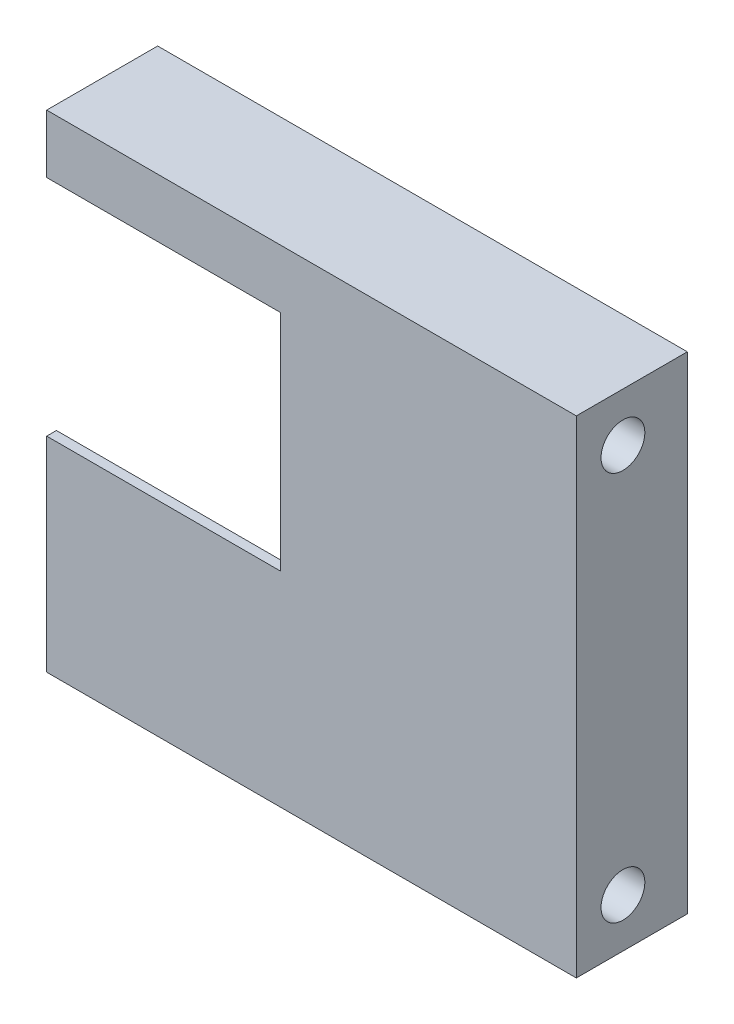
ISO-10303-21;
HEADER;
FILE_DESCRIPTION(('STEP AP214'),'2;1');
FILE_NAME('part.step','',(''),(''),'','','');
FILE_SCHEMA(('AUTOMOTIVE_DESIGN { 1 0 10303 214 1 1 1 1 }'));
ENDSEC;
DATA;
#1=APPLICATION_CONTEXT('core data for automotive mechanical design processes');
#2=APPLICATION_PROTOCOL_DEFINITION('international standard','automotive_design',2000,#1);
#3=PRODUCT_CONTEXT('',#1,'mechanical');
#4=PRODUCT('Part','Part','',(#3));
#5=PRODUCT_RELATED_PRODUCT_CATEGORY('part','',(#4));
#6=PRODUCT_DEFINITION_FORMATION('','',#4);
#7=PRODUCT_DEFINITION_CONTEXT('part definition',#1,'design');
#8=PRODUCT_DEFINITION('design','',#6,#7);
#9=PRODUCT_DEFINITION_SHAPE('','',#8);
#10=(LENGTH_UNIT() NAMED_UNIT(*) SI_UNIT(.MILLI.,.METRE.));
#11=(NAMED_UNIT(*) PLANE_ANGLE_UNIT() SI_UNIT($,.RADIAN.));
#12=(NAMED_UNIT(*) SI_UNIT($,.STERADIAN.) SOLID_ANGLE_UNIT());
#13=UNCERTAINTY_MEASURE_WITH_UNIT(LENGTH_MEASURE(1.E-05),#10,'distance_accuracy_value','');
#14=(GEOMETRIC_REPRESENTATION_CONTEXT(3) GLOBAL_UNCERTAINTY_ASSIGNED_CONTEXT((#13)) GLOBAL_UNIT_ASSIGNED_CONTEXT((#10,
#11,#12)) REPRESENTATION_CONTEXT('',''));
#15=CARTESIAN_POINT('',(0.,0.,0.));
#16=DIRECTION('',(0.,0.,1.));
#17=DIRECTION('',(1.,0.,0.));
#18=AXIS2_PLACEMENT_3D('',#15,#16,#17);
#19=CARTESIAN_POINT('',(25.,0.,0.));
#20=DIRECTION('',(-1.,0.,0.));
#21=DIRECTION('',(0.,0.,1.));
#22=AXIS2_PLACEMENT_3D('',#19,#20,#21);
#23=PLANE('',#22);
#24=DIRECTION('',(0.,0.,1.));
#25=VECTOR('',#24,1.);
#26=CARTESIAN_POINT('',(25.,20.5,-8.4));
#27=LINE('',#26,#25);
#28=CARTESIAN_POINT('',(25.,20.5,-8.4));
#29=VERTEX_POINT('',#28);
#30=CARTESIAN_POINT('',(25.,20.5,-6.4));
#31=VERTEX_POINT('',#30);
#32=EDGE_CURVE('E252',#29,#31,#27,.T.);
#33=ORIENTED_EDGE('',*,*,#32,.F.);
#34=DIRECTION('',(0.,-1.,0.));
#35=VECTOR('',#34,1.);
#36=CARTESIAN_POINT('',(25.,25.,-8.4));
#37=LINE('',#36,#35);
#38=CARTESIAN_POINT('',(25.,19.5,-8.4));
#39=VERTEX_POINT('',#38);
#40=EDGE_CURVE('E53',#29,#39,#37,.T.);
#41=ORIENTED_EDGE('',*,*,#40,.T.);
#42=DIRECTION('',(0.,0.,1.));
#43=VECTOR('',#42,1.);
#44=CARTESIAN_POINT('',(25.,19.5,-10.4));
#45=LINE('',#44,#43);
#46=CARTESIAN_POINT('',(25.,19.5,-10.4));
#47=VERTEX_POINT('',#46);
#48=EDGE_CURVE('E223',#47,#39,#45,.T.);
#49=ORIENTED_EDGE('',*,*,#48,.F.);
#50=DIRECTION('',(0.,1.,0.));
#51=VECTOR('',#50,1.);
#52=CARTESIAN_POINT('',(25.,25.,-10.4));
#53=LINE('',#52,#51);
#54=CARTESIAN_POINT('',(25.,-19.5,-10.4));
#55=VERTEX_POINT('',#54);
#56=EDGE_CURVE('E297',#55,#47,#53,.T.);
#57=ORIENTED_EDGE('',*,*,#56,.F.);
#58=DIRECTION('',(0.,0.,1.));
#59=VECTOR('',#58,1.);
#60=CARTESIAN_POINT('',(25.,-19.5,-10.4));
#61=LINE('',#60,#59);
#62=CARTESIAN_POINT('',(25.,-19.5,-8.4));
#63=VERTEX_POINT('',#62);
#64=EDGE_CURVE('E62',#55,#63,#61,.T.);
#65=ORIENTED_EDGE('',*,*,#64,.T.);
#66=DIRECTION('',(0.,-1.,0.));
#67=VECTOR('',#66,1.);
#68=CARTESIAN_POINT('',(25.,-19.5,-8.4));
#69=LINE('',#68,#67);
#70=CARTESIAN_POINT('',(25.,-20.5,-8.4));
#71=VERTEX_POINT('',#70);
#72=EDGE_CURVE('E221',#63,#71,#69,.T.);
#73=ORIENTED_EDGE('',*,*,#72,.T.);
#74=DIRECTION('',(0.,0.,1.));
#75=VECTOR('',#74,1.);
#76=CARTESIAN_POINT('',(25.,-20.5,-8.4));
#77=LINE('',#76,#75);
#78=CARTESIAN_POINT('',(25.,-20.5,-6.4));
#79=VERTEX_POINT('',#78);
#80=EDGE_CURVE('E260',#71,#79,#77,.T.);
#81=ORIENTED_EDGE('',*,*,#80,.T.);
#82=DIRECTION('',(0.,-1.,0.));
#83=VECTOR('',#82,1.);
#84=CARTESIAN_POINT('',(25.,-24.9999999999997,-6.4));
#85=LINE('',#84,#83);
#86=CARTESIAN_POINT('',(25.,-19.5,-6.4));
#87=VERTEX_POINT('',#86);
#88=EDGE_CURVE('E288',#87,#79,#85,.T.);
#89=ORIENTED_EDGE('',*,*,#88,.F.);
#90=DIRECTION('',(0.,0.,1.));
#91=VECTOR('',#90,1.);
#92=CARTESIAN_POINT('',(25.,-19.5,-6.4));
#93=LINE('',#92,#91);
#94=CARTESIAN_POINT('',(25.,-19.5,-5.98088013202861));
#95=VERTEX_POINT('',#94);
#96=EDGE_CURVE('E286',#87,#95,#93,.T.);
#97=ORIENTED_EDGE('',*,*,#96,.T.);
#98=CARTESIAN_POINT('',(25.,-20.,-3.78713903518058));
#99=DIRECTION('',(1.,0.,0.));
#100=DIRECTION('',(0.,0.,-1.));
#101=AXIS2_PLACEMENT_3D('',#98,#99,#100);
#102=CIRCLE('',#101,2.25);
#103=CARTESIAN_POINT('',(25.,-19.5,-1.59339793833255));
#104=VERTEX_POINT('',#103);
#105=EDGE_CURVE('E300',#95,#104,#102,.T.);
#106=ORIENTED_EDGE('',*,*,#105,.T.);
#107=CARTESIAN_POINT('',(25.,-19.5,0.));
#108=VERTEX_POINT('',#107);
#109=EDGE_CURVE('E285',#104,#108,#93,.T.);
#110=ORIENTED_EDGE('',*,*,#109,.T.);
#111=DIRECTION('',(0.,1.,0.));
#112=VECTOR('',#111,1.);
#113=CARTESIAN_POINT('',(25.,-25.,0.));
#114=LINE('',#113,#112);
#115=CARTESIAN_POINT('',(25.,19.5,0.));
#116=VERTEX_POINT('',#115);
#117=EDGE_CURVE('E324',#108,#116,#114,.T.);
#118=ORIENTED_EDGE('',*,*,#117,.T.);
#119=DIRECTION('',(0.,0.,1.));
#120=VECTOR('',#119,1.);
#121=CARTESIAN_POINT('',(25.,19.5,-6.4));
#122=LINE('',#121,#120);
#123=CARTESIAN_POINT('',(25.,19.5,-1.59339793833255));
#124=VERTEX_POINT('',#123);
#125=EDGE_CURVE('E279',#124,#116,#122,.T.);
#126=ORIENTED_EDGE('',*,*,#125,.F.);
#127=CARTESIAN_POINT('',(25.,20.,-3.78713903518058));
#128=DIRECTION('',(1.,0.,0.));
#129=DIRECTION('',(0.,0.,-1.));
#130=AXIS2_PLACEMENT_3D('',#127,#128,#129);
#131=CIRCLE('',#130,2.25);
#132=CARTESIAN_POINT('',(25.,19.5,-5.98088013202861));
#133=VERTEX_POINT('',#132);
#134=EDGE_CURVE('E308',#124,#133,#131,.T.);
#135=ORIENTED_EDGE('',*,*,#134,.T.);
#136=CARTESIAN_POINT('',(25.,19.5,-6.4));
#137=VERTEX_POINT('',#136);
#138=EDGE_CURVE('E276',#137,#133,#122,.T.);
#139=ORIENTED_EDGE('',*,*,#138,.F.);
#140=DIRECTION('',(0.,-1.,0.));
#141=VECTOR('',#140,1.);
#142=CARTESIAN_POINT('',(25.,19.5,-6.4));
#143=LINE('',#142,#141);
#144=EDGE_CURVE('E265',#31,#137,#143,.T.);
#145=ORIENTED_EDGE('',*,*,#144,.F.);
#146=EDGE_LOOP('',(#33,#41,#49,#57,#65,#73,#81,#89,#97,#106,#110,#118,#126,#135,#139,#145));
#147=FACE_BOUND('',#146,.T.);
#148=ADVANCED_FACE('F39',(#147),#23,.T.);
#149=CARTESIAN_POINT('',(0.,0.,0.));
#150=DIRECTION('',(0.,0.,1.));
#151=DIRECTION('',(1.,0.,0.));
#152=AXIS2_PLACEMENT_3D('',#149,#150,#151);
#153=PLANE('',#152);
#154=DIRECTION('',(-1.,0.,0.));
#155=VECTOR('',#154,1.);
#156=CARTESIAN_POINT('',(-25.,19.5,0.));
#157=LINE('',#156,#155);
#158=CARTESIAN_POINT('',(-25.,19.5,0.));
#159=VERTEX_POINT('',#158);
#160=EDGE_CURVE('E269',#116,#159,#157,.T.);
#161=ORIENTED_EDGE('',*,*,#160,.F.);
#162=ORIENTED_EDGE('',*,*,#117,.F.);
#163=DIRECTION('',(1.,0.,0.));
#164=VECTOR('',#163,1.);
#165=CARTESIAN_POINT('',(-25.,-19.5,0.));
#166=LINE('',#165,#164);
#167=CARTESIAN_POINT('',(-25.,-19.5,0.));
#168=VERTEX_POINT('',#167);
#169=EDGE_CURVE('E273',#168,#108,#166,.T.);
#170=ORIENTED_EDGE('',*,*,#169,.F.);
#171=DIRECTION('',(0.,-1.,0.));
#172=VECTOR('',#171,1.);
#173=CARTESIAN_POINT('',(-25.,-25.,0.));
#174=LINE('',#173,#172);
#175=CARTESIAN_POINT('',(-25.,-4.00000000000001,0.));
#176=VERTEX_POINT('',#175);
#177=EDGE_CURVE('E344',#176,#168,#174,.T.);
#178=ORIENTED_EDGE('',*,*,#177,.F.);
#179=DIRECTION('',(-1.,0.,0.));
#180=VECTOR('',#179,1.);
#181=CARTESIAN_POINT('',(-25.,-4.00000000000001,0.));
#182=LINE('',#181,#180);
#183=CARTESIAN_POINT('',(-0.999999999999994,-4.,0.));
#184=VERTEX_POINT('',#183);
#185=EDGE_CURVE('E342',#184,#176,#182,.T.);
#186=ORIENTED_EDGE('',*,*,#185,.F.);
#187=DIRECTION('',(0.,-1.,0.));
#188=VECTOR('',#187,1.);
#189=CARTESIAN_POINT('',(-0.999999999999994,-4.,0.));
#190=LINE('',#189,#188);
#191=CARTESIAN_POINT('',(-1.,19.,0.));
#192=VERTEX_POINT('',#191);
#193=EDGE_CURVE('E339',#192,#184,#190,.T.);
#194=ORIENTED_EDGE('',*,*,#193,.F.);
#195=DIRECTION('',(1.,0.,0.));
#196=VECTOR('',#195,1.);
#197=CARTESIAN_POINT('',(-1.,19.,0.));
#198=LINE('',#197,#196);
#199=CARTESIAN_POINT('',(-25.,19.,0.));
#200=VERTEX_POINT('',#199);
#201=EDGE_CURVE('E340',#200,#192,#198,.T.);
#202=ORIENTED_EDGE('',*,*,#201,.F.);
#203=DIRECTION('',(0.,-1.,0.));
#204=VECTOR('',#203,1.);
#205=CARTESIAN_POINT('',(-25.,19.,0.));
#206=LINE('',#205,#204);
#207=EDGE_CURVE('E318',#159,#200,#206,.T.);
#208=ORIENTED_EDGE('',*,*,#207,.F.);
#209=EDGE_LOOP('',(#161,#162,#170,#178,#186,#194,#202,#208));
#210=FACE_BOUND('',#209,.T.);
#211=ADVANCED_FACE('F362',(#210),#153,.F.);
#212=CARTESIAN_POINT('',(-25.,25.,1.));
#213=DIRECTION('',(0.,-1.,0.));
#214=DIRECTION('',(1.,0.,0.));
#215=AXIS2_PLACEMENT_3D('',#212,#213,#214);
#216=PLANE('',#215);
#217=DIRECTION('',(-1.,0.,0.));
#218=VECTOR('',#217,1.);
#219=CARTESIAN_POINT('',(29.4,25.,-10.4));
#220=LINE('',#219,#218);
#221=CARTESIAN_POINT('',(29.4,25.,-10.4));
#222=VERTEX_POINT('',#221);
#223=CARTESIAN_POINT('',(-25.,25.,-10.4));
#224=VERTEX_POINT('',#223);
#225=EDGE_CURVE('E199',#222,#224,#220,.T.);
#226=ORIENTED_EDGE('',*,*,#225,.T.);
#227=DIRECTION('',(0.,0.,-1.));
#228=VECTOR('',#227,1.);
#229=CARTESIAN_POINT('',(-25.,25.,1.));
#230=LINE('',#229,#228);
#231=CARTESIAN_POINT('',(-25.,25.,1.));
#232=VERTEX_POINT('',#231);
#233=EDGE_CURVE('E11',#232,#224,#230,.T.);
#234=ORIENTED_EDGE('',*,*,#233,.F.);
#235=DIRECTION('',(-1.,0.,0.));
#236=VECTOR('',#235,1.);
#237=CARTESIAN_POINT('',(-25.,25.,1.));
#238=LINE('',#237,#236);
#239=CARTESIAN_POINT('',(29.4,25.,1.));
#240=VERTEX_POINT('',#239);
#241=EDGE_CURVE('E322',#240,#232,#238,.T.);
#242=ORIENTED_EDGE('',*,*,#241,.F.);
#243=DIRECTION('',(0.,0.,1.));
#244=VECTOR('',#243,1.);
#245=CARTESIAN_POINT('',(29.4,25.,1.));
#246=LINE('',#245,#244);
#247=EDGE_CURVE('E200',#222,#240,#246,.T.);
#248=ORIENTED_EDGE('',*,*,#247,.F.);
#249=EDGE_LOOP('',(#226,#234,#242,#248));
#250=FACE_BOUND('',#249,.T.);
#251=ADVANCED_FACE('F41',(#250),#216,.F.);
#252=CARTESIAN_POINT('',(-25.,19.,1.));
#253=DIRECTION('',(1.,0.,0.));
#254=DIRECTION('',(0.,1.,0.));
#255=AXIS2_PLACEMENT_3D('',#252,#253,#254);
#256=PLANE('',#255);
#257=ORIENTED_EDGE('',*,*,#233,.T.);
#258=DIRECTION('',(0.,1.,0.));
#259=VECTOR('',#258,1.);
#260=CARTESIAN_POINT('',(-25.,25.,-10.4));
#261=LINE('',#260,#259);
#262=CARTESIAN_POINT('',(-25.,19.5,-10.4));
#263=VERTEX_POINT('',#262);
#264=EDGE_CURVE('E192',#263,#224,#261,.T.);
#265=ORIENTED_EDGE('',*,*,#264,.F.);
#266=DIRECTION('',(0.,0.,1.));
#267=VECTOR('',#266,1.);
#268=CARTESIAN_POINT('',(-25.,19.5,-10.4));
#269=LINE('',#268,#267);
#270=CARTESIAN_POINT('',(-25.,19.5,-8.4));
#271=VERTEX_POINT('',#270);
#272=EDGE_CURVE('E211',#263,#271,#269,.T.);
#273=ORIENTED_EDGE('',*,*,#272,.T.);
#274=DIRECTION('',(0.,1.,0.));
#275=VECTOR('',#274,1.);
#276=CARTESIAN_POINT('',(-25.,25.,-8.4));
#277=LINE('',#276,#275);
#278=CARTESIAN_POINT('',(-25.,20.5,-8.4));
#279=VERTEX_POINT('',#278);
#280=EDGE_CURVE('E219',#271,#279,#277,.T.);
#281=ORIENTED_EDGE('',*,*,#280,.T.);
#282=DIRECTION('',(0.,0.,1.));
#283=VECTOR('',#282,1.);
#284=CARTESIAN_POINT('',(-25.,20.5,-8.4));
#285=LINE('',#284,#283);
#286=CARTESIAN_POINT('',(-25.,20.5,-6.4));
#287=VERTEX_POINT('',#286);
#288=EDGE_CURVE('E242',#279,#287,#285,.T.);
#289=ORIENTED_EDGE('',*,*,#288,.T.);
#290=DIRECTION('',(0.,1.,0.));
#291=VECTOR('',#290,1.);
#292=CARTESIAN_POINT('',(-25.,19.5,-6.4));
#293=LINE('',#292,#291);
#294=CARTESIAN_POINT('',(-25.,19.5,-6.4));
#295=VERTEX_POINT('',#294);
#296=EDGE_CURVE('E270',#295,#287,#293,.T.);
#297=ORIENTED_EDGE('',*,*,#296,.F.);
#298=DIRECTION('',(0.,0.,1.));
#299=VECTOR('',#298,1.);
#300=CARTESIAN_POINT('',(-25.,19.5,-6.4));
#301=LINE('',#300,#299);
#302=EDGE_CURVE('E275',#295,#159,#301,.T.);
#303=ORIENTED_EDGE('',*,*,#302,.T.);
#304=ORIENTED_EDGE('',*,*,#207,.T.);
#305=DIRECTION('',(0.,0.,-1.));
#306=VECTOR('',#305,1.);
#307=CARTESIAN_POINT('',(-25.,19.,1.));
#308=LINE('',#307,#306);
#309=CARTESIAN_POINT('',(-25.,19.,1.));
#310=VERTEX_POINT('',#309);
#311=EDGE_CURVE('E50',#310,#200,#308,.T.);
#312=ORIENTED_EDGE('',*,*,#311,.F.);
#313=DIRECTION('',(0.,-1.,0.));
#314=VECTOR('',#313,1.);
#315=CARTESIAN_POINT('',(-25.,19.,1.));
#316=LINE('',#315,#314);
#317=EDGE_CURVE('E194',#232,#310,#316,.T.);
#318=ORIENTED_EDGE('',*,*,#317,.F.);
#319=EDGE_LOOP('',(#257,#265,#273,#281,#289,#297,#303,#304,#312,#318));
#320=FACE_BOUND('',#319,.T.);
#321=ADVANCED_FACE('F189',(#320),#256,.F.);
#322=CARTESIAN_POINT('',(-1.,19.,1.));
#323=DIRECTION('',(0.,1.,0.));
#324=DIRECTION('',(0.,0.,1.));
#325=AXIS2_PLACEMENT_3D('',#322,#323,#324);
#326=PLANE('',#325);
#327=ORIENTED_EDGE('',*,*,#201,.T.);
#328=DIRECTION('',(0.,0.,-1.));
#329=VECTOR('',#328,1.);
#330=CARTESIAN_POINT('',(-1.,19.,1.));
#331=LINE('',#330,#329);
#332=CARTESIAN_POINT('',(-1.,19.,1.));
#333=VERTEX_POINT('',#332);
#334=EDGE_CURVE('E355',#333,#192,#331,.T.);
#335=ORIENTED_EDGE('',*,*,#334,.F.);
#336=DIRECTION('',(1.,0.,0.));
#337=VECTOR('',#336,1.);
#338=CARTESIAN_POINT('',(-1.,19.,1.));
#339=LINE('',#338,#337);
#340=EDGE_CURVE('E323',#310,#333,#339,.T.);
#341=ORIENTED_EDGE('',*,*,#340,.F.);
#342=ORIENTED_EDGE('',*,*,#311,.T.);
#343=EDGE_LOOP('',(#327,#335,#341,#342));
#344=FACE_BOUND('',#343,.T.);
#345=ADVANCED_FACE('F363',(#344),#326,.F.);
#346=CARTESIAN_POINT('',(-0.999999999999994,-4.,1.));
#347=DIRECTION('',(1.,0.,0.));
#348=DIRECTION('',(0.,1.,0.));
#349=AXIS2_PLACEMENT_3D('',#346,#347,#348);
#350=PLANE('',#349);
#351=ORIENTED_EDGE('',*,*,#193,.T.);
#352=DIRECTION('',(0.,0.,-1.));
#353=VECTOR('',#352,1.);
#354=CARTESIAN_POINT('',(-0.999999999999994,-4.,1.));
#355=LINE('',#354,#353);
#356=CARTESIAN_POINT('',(-0.999999999999994,-4.,1.));
#357=VERTEX_POINT('',#356);
#358=EDGE_CURVE('E352',#357,#184,#355,.T.);
#359=ORIENTED_EDGE('',*,*,#358,.F.);
#360=DIRECTION('',(0.,-1.,0.));
#361=VECTOR('',#360,1.);
#362=CARTESIAN_POINT('',(-0.999999999999994,-4.,1.));
#363=LINE('',#362,#361);
#364=EDGE_CURVE('E327',#333,#357,#363,.T.);
#365=ORIENTED_EDGE('',*,*,#364,.F.);
#366=ORIENTED_EDGE('',*,*,#334,.T.);
#367=EDGE_LOOP('',(#351,#359,#365,#366));
#368=FACE_BOUND('',#367,.T.);
#369=ADVANCED_FACE('F369',(#368),#350,.F.);
#370=CARTESIAN_POINT('',(-25.,-4.00000000000001,1.));
#371=DIRECTION('',(0.,-1.,0.));
#372=DIRECTION('',(1.,0.,0.));
#373=AXIS2_PLACEMENT_3D('',#370,#371,#372);
#374=PLANE('',#373);
#375=ORIENTED_EDGE('',*,*,#185,.T.);
#376=DIRECTION('',(0.,0.,-1.));
#377=VECTOR('',#376,1.);
#378=CARTESIAN_POINT('',(-25.,-4.00000000000001,1.));
#379=LINE('',#378,#377);
#380=CARTESIAN_POINT('',(-25.,-4.00000000000001,1.));
#381=VERTEX_POINT('',#380);
#382=EDGE_CURVE('E348',#381,#176,#379,.T.);
#383=ORIENTED_EDGE('',*,*,#382,.F.);
#384=DIRECTION('',(-1.,0.,0.));
#385=VECTOR('',#384,1.);
#386=CARTESIAN_POINT('',(-25.,-4.00000000000001,1.));
#387=LINE('',#386,#385);
#388=EDGE_CURVE('E328',#357,#381,#387,.T.);
#389=ORIENTED_EDGE('',*,*,#388,.F.);
#390=ORIENTED_EDGE('',*,*,#358,.T.);
#391=EDGE_LOOP('',(#375,#383,#389,#390));
#392=FACE_BOUND('',#391,.T.);
#393=ADVANCED_FACE('F372',(#392),#374,.F.);
#394=CARTESIAN_POINT('',(-25.,-25.,1.));
#395=DIRECTION('',(1.,0.,0.));
#396=DIRECTION('',(0.,1.,0.));
#397=AXIS2_PLACEMENT_3D('',#394,#395,#396);
#398=PLANE('',#397);
#399=ORIENTED_EDGE('',*,*,#177,.T.);
#400=DIRECTION('',(0.,0.,1.));
#401=VECTOR('',#400,1.);
#402=CARTESIAN_POINT('',(-25.,-19.5,-6.4));
#403=LINE('',#402,#401);
#404=CARTESIAN_POINT('',(-25.,-19.5,-6.4));
#405=VERTEX_POINT('',#404);
#406=EDGE_CURVE('E251',#405,#168,#403,.T.);
#407=ORIENTED_EDGE('',*,*,#406,.F.);
#408=DIRECTION('',(0.,1.,0.));
#409=VECTOR('',#408,1.);
#410=CARTESIAN_POINT('',(-25.,-25.,-6.4));
#411=LINE('',#410,#409);
#412=CARTESIAN_POINT('',(-25.,-20.5,-6.4));
#413=VERTEX_POINT('',#412);
#414=EDGE_CURVE('E292',#413,#405,#411,.T.);
#415=ORIENTED_EDGE('',*,*,#414,.F.);
#416=DIRECTION('',(0.,0.,1.));
#417=VECTOR('',#416,1.);
#418=CARTESIAN_POINT('',(-25.,-20.5,-8.4));
#419=LINE('',#418,#417);
#420=CARTESIAN_POINT('',(-25.,-20.5,-8.4));
#421=VERTEX_POINT('',#420);
#422=EDGE_CURVE('E228',#421,#413,#419,.T.);
#423=ORIENTED_EDGE('',*,*,#422,.F.);
#424=DIRECTION('',(0.,1.,0.));
#425=VECTOR('',#424,1.);
#426=CARTESIAN_POINT('',(-25.,-19.5,-8.4));
#427=LINE('',#426,#425);
#428=CARTESIAN_POINT('',(-25.,-19.5,-8.4));
#429=VERTEX_POINT('',#428);
#430=EDGE_CURVE('E234',#421,#429,#427,.T.);
#431=ORIENTED_EDGE('',*,*,#430,.T.);
#432=DIRECTION('',(0.,0.,1.));
#433=VECTOR('',#432,1.);
#434=CARTESIAN_POINT('',(-25.,-19.5,-10.4));
#435=LINE('',#434,#433);
#436=CARTESIAN_POINT('',(-25.,-19.5,-10.4));
#437=VERTEX_POINT('',#436);
#438=EDGE_CURVE('E227',#437,#429,#435,.T.);
#439=ORIENTED_EDGE('',*,*,#438,.F.);
#440=DIRECTION('',(0.,1.,0.));
#441=VECTOR('',#440,1.);
#442=CARTESIAN_POINT('',(-25.,-19.5,-10.4));
#443=LINE('',#442,#441);
#444=CARTESIAN_POINT('',(-25.,-25.,-10.4));
#445=VERTEX_POINT('',#444);
#446=EDGE_CURVE('E232',#445,#437,#443,.T.);
#447=ORIENTED_EDGE('',*,*,#446,.F.);
#448=DIRECTION('',(0.,0.,-1.));
#449=VECTOR('',#448,1.);
#450=CARTESIAN_POINT('',(-25.,-25.,1.));
#451=LINE('',#450,#449);
#452=CARTESIAN_POINT('',(-25.,-25.,1.));
#453=VERTEX_POINT('',#452);
#454=EDGE_CURVE('E335',#453,#445,#451,.T.);
#455=ORIENTED_EDGE('',*,*,#454,.F.);
#456=DIRECTION('',(0.,-1.,0.));
#457=VECTOR('',#456,1.);
#458=CARTESIAN_POINT('',(-25.,-25.,1.));
#459=LINE('',#458,#457);
#460=EDGE_CURVE('E331',#381,#453,#459,.T.);
#461=ORIENTED_EDGE('',*,*,#460,.F.);
#462=ORIENTED_EDGE('',*,*,#382,.T.);
#463=EDGE_LOOP('',(#399,#407,#415,#423,#431,#439,#447,#455,#461,#462));
#464=FACE_BOUND('',#463,.T.);
#465=ADVANCED_FACE('F388',(#464),#398,.F.);
#466=CARTESIAN_POINT('',(-25.,-25.,1.));
#467=DIRECTION('',(0.,1.,0.));
#468=DIRECTION('',(-1.,0.,0.));
#469=AXIS2_PLACEMENT_3D('',#466,#467,#468);
#470=PLANE('',#469);
#471=ORIENTED_EDGE('',*,*,#454,.T.);
#472=DIRECTION('',(-1.,0.,0.));
#473=VECTOR('',#472,1.);
#474=CARTESIAN_POINT('',(29.4,-25.,-10.4));
#475=LINE('',#474,#473);
#476=CARTESIAN_POINT('',(29.4,-25.,-10.4));
#477=VERTEX_POINT('',#476);
#478=EDGE_CURVE('E204',#477,#445,#475,.T.);
#479=ORIENTED_EDGE('',*,*,#478,.F.);
#480=DIRECTION('',(0.,0.,-1.));
#481=VECTOR('',#480,1.);
#482=CARTESIAN_POINT('',(29.4,-25.,1.));
#483=LINE('',#482,#481);
#484=CARTESIAN_POINT('',(29.4,-25.,1.));
#485=VERTEX_POINT('',#484);
#486=EDGE_CURVE('E314',#485,#477,#483,.T.);
#487=ORIENTED_EDGE('',*,*,#486,.F.);
#488=DIRECTION('',(1.,0.,0.));
#489=VECTOR('',#488,1.);
#490=CARTESIAN_POINT('',(-25.,-25.,1.));
#491=LINE('',#490,#489);
#492=EDGE_CURVE('E334',#453,#485,#491,.T.);
#493=ORIENTED_EDGE('',*,*,#492,.F.);
#494=EDGE_LOOP('',(#471,#479,#487,#493));
#495=FACE_BOUND('',#494,.T.);
#496=ADVANCED_FACE('F459',(#495),#470,.F.);
#497=CARTESIAN_POINT('',(0.,0.,1.));
#498=DIRECTION('',(0.,0.,1.));
#499=DIRECTION('',(1.,0.,0.));
#500=AXIS2_PLACEMENT_3D('',#497,#498,#499);
#501=PLANE('',#500);
#502=ORIENTED_EDGE('',*,*,#241,.T.);
#503=ORIENTED_EDGE('',*,*,#317,.T.);
#504=ORIENTED_EDGE('',*,*,#340,.T.);
#505=ORIENTED_EDGE('',*,*,#364,.T.);
#506=ORIENTED_EDGE('',*,*,#388,.T.);
#507=ORIENTED_EDGE('',*,*,#460,.T.);
#508=ORIENTED_EDGE('',*,*,#492,.T.);
#509=DIRECTION('',(0.,-1.,0.));
#510=VECTOR('',#509,1.);
#511=CARTESIAN_POINT('',(29.4,25.,1.));
#512=LINE('',#511,#510);
#513=EDGE_CURVE('E315',#240,#485,#512,.T.);
#514=ORIENTED_EDGE('',*,*,#513,.F.);
#515=EDGE_LOOP('',(#502,#503,#504,#505,#506,#507,#508,#514));
#516=FACE_BOUND('',#515,.T.);
#517=ADVANCED_FACE('F377',(#516),#501,.T.);
#518=CARTESIAN_POINT('',(29.4,25.,-10.4));
#519=DIRECTION('',(0.,0.,1.));
#520=DIRECTION('',(0.,-1.,0.));
#521=AXIS2_PLACEMENT_3D('',#518,#519,#520);
#522=PLANE('',#521);
#523=ORIENTED_EDGE('',*,*,#478,.T.);
#524=ORIENTED_EDGE('',*,*,#446,.T.);
#525=DIRECTION('',(1.,0.,0.));
#526=VECTOR('',#525,1.);
#527=CARTESIAN_POINT('',(25.,-19.5,-10.4));
#528=LINE('',#527,#526);
#529=EDGE_CURVE('E233',#437,#55,#528,.T.);
#530=ORIENTED_EDGE('',*,*,#529,.T.);
#531=ORIENTED_EDGE('',*,*,#56,.T.);
#532=DIRECTION('',(-1.,0.,0.));
#533=VECTOR('',#532,1.);
#534=CARTESIAN_POINT('',(25.,19.5,-10.4));
#535=LINE('',#534,#533);
#536=EDGE_CURVE('E208',#47,#263,#535,.T.);
#537=ORIENTED_EDGE('',*,*,#536,.T.);
#538=ORIENTED_EDGE('',*,*,#264,.T.);
#539=ORIENTED_EDGE('',*,*,#225,.F.);
#540=DIRECTION('',(0.,1.,0.));
#541=VECTOR('',#540,1.);
#542=CARTESIAN_POINT('',(29.4,25.,-10.4));
#543=LINE('',#542,#541);
#544=EDGE_CURVE('E203',#477,#222,#543,.T.);
#545=ORIENTED_EDGE('',*,*,#544,.F.);
#546=EDGE_LOOP('',(#523,#524,#530,#531,#537,#538,#539,#545));
#547=FACE_BOUND('',#546,.T.);
#548=ADVANCED_FACE('F210',(#547),#522,.F.);
#549=CARTESIAN_POINT('',(29.4,0.,0.));
#550=DIRECTION('',(-1.,0.,0.));
#551=DIRECTION('',(0.,0.,1.));
#552=AXIS2_PLACEMENT_3D('',#549,#550,#551);
#553=PLANE('',#552);
#554=CARTESIAN_POINT('',(29.4,-20.,-3.78713903518058));
#555=DIRECTION('',(1.,0.,0.));
#556=DIRECTION('',(0.,0.,-1.));
#557=AXIS2_PLACEMENT_3D('',#554,#555,#556);
#558=CIRCLE('',#557,2.25);
#559=CARTESIAN_POINT('',(29.4,-20.,-6.03713903518058));
#560=VERTEX_POINT('',#559);
#561=EDGE_CURVE('E305',#560,#560,#558,.T.);
#562=ORIENTED_EDGE('',*,*,#561,.F.);
#563=EDGE_LOOP('',(#562));
#564=FACE_BOUND('',#563,.T.);
#565=CARTESIAN_POINT('',(29.4,20.,-3.78713903518058));
#566=DIRECTION('',(1.,0.,0.));
#567=DIRECTION('',(0.,0.,-1.));
#568=AXIS2_PLACEMENT_3D('',#565,#566,#567);
#569=CIRCLE('',#568,2.25);
#570=CARTESIAN_POINT('',(29.4,20.,-6.03713903518058));
#571=VERTEX_POINT('',#570);
#572=EDGE_CURVE('E304',#571,#571,#569,.T.);
#573=ORIENTED_EDGE('',*,*,#572,.F.);
#574=EDGE_LOOP('',(#573));
#575=FACE_BOUND('',#574,.T.);
#576=ORIENTED_EDGE('',*,*,#247,.T.);
#577=ORIENTED_EDGE('',*,*,#513,.T.);
#578=ORIENTED_EDGE('',*,*,#486,.T.);
#579=ORIENTED_EDGE('',*,*,#544,.T.);
#580=EDGE_LOOP('',(#576,#577,#578,#579));
#581=FACE_BOUND('',#580,.T.);
#582=ADVANCED_FACE('F381',(#564,#575,#581),#553,.F.);
#583=CARTESIAN_POINT('',(25.,20.,-3.78713903518058));
#584=DIRECTION('',(1.,0.,0.));
#585=DIRECTION('',(0.,0.,-1.));
#586=AXIS2_PLACEMENT_3D('',#583,#584,#585);
#587=CYLINDRICAL_SURFACE('',#586,2.25);
#588=ORIENTED_EDGE('',*,*,#134,.F.);
#589=EDGE_CURVE('E282',#133,#124,#131,.T.);
#590=ORIENTED_EDGE('',*,*,#589,.F.);
#591=EDGE_LOOP('',(#588,#590));
#592=FACE_BOUND('',#591,.T.);
#593=ORIENTED_EDGE('',*,*,#572,.T.);
#594=EDGE_LOOP('',(#593));
#595=FACE_BOUND('',#594,.T.);
#596=ADVANCED_FACE('F435',(#592,#595),#587,.F.);
#597=CARTESIAN_POINT('',(25.,-20.,-3.78713903518058));
#598=DIRECTION('',(1.,0.,0.));
#599=DIRECTION('',(0.,0.,-1.));
#600=AXIS2_PLACEMENT_3D('',#597,#598,#599);
#601=CYLINDRICAL_SURFACE('',#600,2.25);
#602=ORIENTED_EDGE('',*,*,#105,.F.);
#603=EDGE_CURVE('E301',#104,#95,#102,.T.);
#604=ORIENTED_EDGE('',*,*,#603,.F.);
#605=EDGE_LOOP('',(#602,#604));
#606=FACE_BOUND('',#605,.T.);
#607=ORIENTED_EDGE('',*,*,#561,.T.);
#608=EDGE_LOOP('',(#607));
#609=FACE_BOUND('',#608,.T.);
#610=ADVANCED_FACE('F429',(#606,#609),#601,.F.);
#611=CARTESIAN_POINT('',(25.,-24.9999999999997,-6.4));
#612=DIRECTION('',(-1.,0.,0.));
#613=DIRECTION('',(0.,-1.,0.));
#614=AXIS2_PLACEMENT_3D('',#611,#612,#613);
#615=PLANE('',#614);
#616=EDGE_CURVE('E290',#95,#104,#93,.T.);
#617=ORIENTED_EDGE('',*,*,#616,.T.);
#618=ORIENTED_EDGE('',*,*,#603,.T.);
#619=EDGE_LOOP('',(#617,#618));
#620=FACE_BOUND('',#619,.T.);
#621=ADVANCED_FACE('F428',(#620),#615,.F.);
#622=CARTESIAN_POINT('',(-25.,-19.5,-6.4));
#623=DIRECTION('',(0.,-1.,0.));
#624=DIRECTION('',(0.,0.,-1.));
#625=AXIS2_PLACEMENT_3D('',#622,#623,#624);
#626=PLANE('',#625);
#627=ORIENTED_EDGE('',*,*,#169,.T.);
#628=ORIENTED_EDGE('',*,*,#109,.F.);
#629=ORIENTED_EDGE('',*,*,#616,.F.);
#630=ORIENTED_EDGE('',*,*,#96,.F.);
#631=DIRECTION('',(1.,0.,0.));
#632=VECTOR('',#631,1.);
#633=CARTESIAN_POINT('',(-25.,-19.5,-6.4));
#634=LINE('',#633,#632);
#635=EDGE_CURVE('E295',#405,#87,#634,.T.);
#636=ORIENTED_EDGE('',*,*,#635,.F.);
#637=ORIENTED_EDGE('',*,*,#406,.T.);
#638=EDGE_LOOP('',(#627,#628,#629,#630,#636,#637));
#639=FACE_BOUND('',#638,.T.);
#640=ADVANCED_FACE('F569',(#639),#626,.F.);
#641=CARTESIAN_POINT('',(0.,0.,-6.4));
#642=DIRECTION('',(0.,0.,-1.));
#643=DIRECTION('',(-1.,0.,0.));
#644=AXIS2_PLACEMENT_3D('',#641,#642,#643);
#645=PLANE('',#644);
#646=DIRECTION('',(1.,0.,0.));
#647=VECTOR('',#646,1.);
#648=CARTESIAN_POINT('',(25.,-20.5,-6.4));
#649=LINE('',#648,#647);
#650=EDGE_CURVE('E247',#413,#79,#649,.T.);
#651=ORIENTED_EDGE('',*,*,#650,.F.);
#652=ORIENTED_EDGE('',*,*,#414,.T.);
#653=ORIENTED_EDGE('',*,*,#635,.T.);
#654=ORIENTED_EDGE('',*,*,#88,.T.);
#655=EDGE_LOOP('',(#651,#652,#653,#654));
#656=FACE_BOUND('',#655,.T.);
#657=ADVANCED_FACE('F568',(#656),#645,.T.);
#658=CARTESIAN_POINT('',(25.,19.5,-6.4));
#659=DIRECTION('',(-1.,0.,0.));
#660=DIRECTION('',(0.,-1.,0.));
#661=AXIS2_PLACEMENT_3D('',#658,#659,#660);
#662=PLANE('',#661);
#663=EDGE_CURVE('E284',#133,#124,#122,.T.);
#664=ORIENTED_EDGE('',*,*,#663,.F.);
#665=ORIENTED_EDGE('',*,*,#589,.T.);
#666=EDGE_LOOP('',(#664,#665));
#667=FACE_BOUND('',#666,.T.);
#668=ADVANCED_FACE('F564',(#667),#662,.F.);
#669=CARTESIAN_POINT('',(-25.,19.5,-6.4));
#670=DIRECTION('',(0.,1.,0.));
#671=DIRECTION('',(0.,0.,1.));
#672=AXIS2_PLACEMENT_3D('',#669,#670,#671);
#673=PLANE('',#672);
#674=ORIENTED_EDGE('',*,*,#160,.T.);
#675=ORIENTED_EDGE('',*,*,#302,.F.);
#676=DIRECTION('',(-1.,0.,0.));
#677=VECTOR('',#676,1.);
#678=CARTESIAN_POINT('',(-25.,19.5,-6.4));
#679=LINE('',#678,#677);
#680=EDGE_CURVE('E267',#137,#295,#679,.T.);
#681=ORIENTED_EDGE('',*,*,#680,.F.);
#682=ORIENTED_EDGE('',*,*,#138,.T.);
#683=ORIENTED_EDGE('',*,*,#663,.T.);
#684=ORIENTED_EDGE('',*,*,#125,.T.);
#685=EDGE_LOOP('',(#674,#675,#681,#682,#683,#684));
#686=FACE_BOUND('',#685,.T.);
#687=ADVANCED_FACE('F414',(#686),#673,.F.);
#688=CARTESIAN_POINT('',(0.,0.,-6.4));
#689=DIRECTION('',(0.,0.,-1.));
#690=DIRECTION('',(-1.,0.,0.));
#691=AXIS2_PLACEMENT_3D('',#688,#689,#690);
#692=PLANE('',#691);
#693=DIRECTION('',(-1.,0.,0.));
#694=VECTOR('',#693,1.);
#695=CARTESIAN_POINT('',(25.,20.5,-6.4));
#696=LINE('',#695,#694);
#697=EDGE_CURVE('E244',#31,#287,#696,.T.);
#698=ORIENTED_EDGE('',*,*,#697,.F.);
#699=ORIENTED_EDGE('',*,*,#144,.T.);
#700=ORIENTED_EDGE('',*,*,#680,.T.);
#701=ORIENTED_EDGE('',*,*,#296,.T.);
#702=EDGE_LOOP('',(#698,#699,#700,#701));
#703=FACE_BOUND('',#702,.T.);
#704=ADVANCED_FACE('F409',(#703),#692,.T.);
#705=CARTESIAN_POINT('',(25.,20.5,-8.4));
#706=DIRECTION('',(0.,1.,0.));
#707=DIRECTION('',(0.,0.,1.));
#708=AXIS2_PLACEMENT_3D('',#705,#706,#707);
#709=PLANE('',#708);
#710=ORIENTED_EDGE('',*,*,#697,.T.);
#711=ORIENTED_EDGE('',*,*,#288,.F.);
#712=DIRECTION('',(-1.,0.,0.));
#713=VECTOR('',#712,1.);
#714=CARTESIAN_POINT('',(25.,20.5,-8.4));
#715=LINE('',#714,#713);
#716=EDGE_CURVE('E241',#29,#279,#715,.T.);
#717=ORIENTED_EDGE('',*,*,#716,.F.);
#718=ORIENTED_EDGE('',*,*,#32,.T.);
#719=EDGE_LOOP('',(#710,#711,#717,#718));
#720=FACE_BOUND('',#719,.T.);
#721=ADVANCED_FACE('F404',(#720),#709,.F.);
#722=CARTESIAN_POINT('',(25.,-20.5,-8.4));
#723=DIRECTION('',(0.,-1.,0.));
#724=DIRECTION('',(0.,0.,-1.));
#725=AXIS2_PLACEMENT_3D('',#722,#723,#724);
#726=PLANE('',#725);
#727=ORIENTED_EDGE('',*,*,#650,.T.);
#728=ORIENTED_EDGE('',*,*,#80,.F.);
#729=DIRECTION('',(1.,0.,0.));
#730=VECTOR('',#729,1.);
#731=CARTESIAN_POINT('',(25.,-20.5,-8.4));
#732=LINE('',#731,#730);
#733=EDGE_CURVE('E258',#421,#71,#732,.T.);
#734=ORIENTED_EDGE('',*,*,#733,.F.);
#735=ORIENTED_EDGE('',*,*,#422,.T.);
#736=EDGE_LOOP('',(#727,#728,#734,#735));
#737=FACE_BOUND('',#736,.T.);
#738=ADVANCED_FACE('F528',(#737),#726,.F.);
#739=CARTESIAN_POINT('',(0.,0.,-8.4));
#740=DIRECTION('',(0.,0.,-1.));
#741=DIRECTION('',(-1.,0.,0.));
#742=AXIS2_PLACEMENT_3D('',#739,#740,#741);
#743=PLANE('',#742);
#744=ORIENTED_EDGE('',*,*,#430,.F.);
#745=ORIENTED_EDGE('',*,*,#733,.T.);
#746=ORIENTED_EDGE('',*,*,#72,.F.);
#747=DIRECTION('',(1.,0.,0.));
#748=VECTOR('',#747,1.);
#749=CARTESIAN_POINT('',(25.,-19.5,-8.4));
#750=LINE('',#749,#748);
#751=EDGE_CURVE('E235',#429,#63,#750,.T.);
#752=ORIENTED_EDGE('',*,*,#751,.F.);
#753=EDGE_LOOP('',(#744,#745,#746,#752));
#754=FACE_BOUND('',#753,.T.);
#755=ADVANCED_FACE('F524',(#754),#743,.F.);
#756=CARTESIAN_POINT('',(25.,-19.5,-10.4));
#757=DIRECTION('',(0.,-1.,0.));
#758=DIRECTION('',(0.,0.,-1.));
#759=AXIS2_PLACEMENT_3D('',#756,#757,#758);
#760=PLANE('',#759);
#761=ORIENTED_EDGE('',*,*,#751,.T.);
#762=ORIENTED_EDGE('',*,*,#64,.F.);
#763=ORIENTED_EDGE('',*,*,#529,.F.);
#764=ORIENTED_EDGE('',*,*,#438,.T.);
#765=EDGE_LOOP('',(#761,#762,#763,#764));
#766=FACE_BOUND('',#765,.T.);
#767=ADVANCED_FACE('F395',(#766),#760,.F.);
#768=CARTESIAN_POINT('',(0.,0.,-8.4));
#769=DIRECTION('',(0.,0.,-1.));
#770=DIRECTION('',(-1.,0.,0.));
#771=AXIS2_PLACEMENT_3D('',#768,#769,#770);
#772=PLANE('',#771);
#773=ORIENTED_EDGE('',*,*,#40,.F.);
#774=ORIENTED_EDGE('',*,*,#716,.T.);
#775=ORIENTED_EDGE('',*,*,#280,.F.);
#776=DIRECTION('',(-1.,0.,0.));
#777=VECTOR('',#776,1.);
#778=CARTESIAN_POINT('',(25.,19.5,-8.4));
#779=LINE('',#778,#777);
#780=EDGE_CURVE('E215',#39,#271,#779,.T.);
#781=ORIENTED_EDGE('',*,*,#780,.F.);
#782=EDGE_LOOP('',(#773,#774,#775,#781));
#783=FACE_BOUND('',#782,.T.);
#784=ADVANCED_FACE('F402',(#783),#772,.F.);
#785=CARTESIAN_POINT('',(25.,19.5,-10.4));
#786=DIRECTION('',(0.,1.,0.));
#787=DIRECTION('',(0.,0.,1.));
#788=AXIS2_PLACEMENT_3D('',#785,#786,#787);
#789=PLANE('',#788);
#790=ORIENTED_EDGE('',*,*,#780,.T.);
#791=ORIENTED_EDGE('',*,*,#272,.F.);
#792=ORIENTED_EDGE('',*,*,#536,.F.);
#793=ORIENTED_EDGE('',*,*,#48,.T.);
#794=EDGE_LOOP('',(#790,#791,#792,#793));
#795=FACE_BOUND('',#794,.T.);
#796=ADVANCED_FACE('F397',(#795),#789,.F.);
#797=CLOSED_SHELL('',(#148,#211,#251,#321,#345,#369,#393,#465,#496,#517,#548,#582,#596,#610,
#621,#640,#657,#668,#687,#704,#721,#738,#755,#767,#784,#796));
#798=MANIFOLD_SOLID_BREP('B2',#797);
#799=ADVANCED_BREP_SHAPE_REPRESENTATION('',(#18,#798),#14);
#800=SHAPE_DEFINITION_REPRESENTATION(#9,#799);
ENDSEC;
END-ISO-10303-21;
